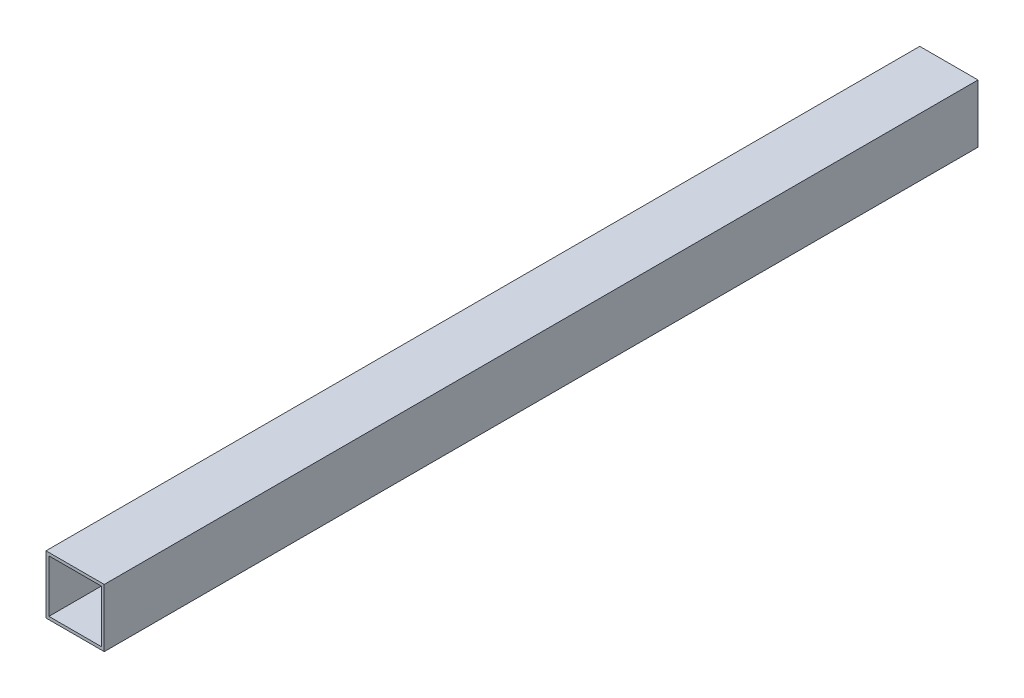
ISO-10303-21;
HEADER;
FILE_DESCRIPTION(('STEP AP214'),'2;1');
FILE_NAME('part.step','',(''),(''),'','','');
FILE_SCHEMA(('AUTOMOTIVE_DESIGN { 1 0 10303 214 1 1 1 1 }'));
ENDSEC;
DATA;
#1=APPLICATION_CONTEXT('core data for automotive mechanical design processes');
#2=APPLICATION_PROTOCOL_DEFINITION('international standard','automotive_design',2000,#1);
#3=PRODUCT_CONTEXT('',#1,'mechanical');
#4=PRODUCT('Part','Part','',(#3));
#5=PRODUCT_RELATED_PRODUCT_CATEGORY('part','',(#4));
#6=PRODUCT_DEFINITION_FORMATION('','',#4);
#7=PRODUCT_DEFINITION_CONTEXT('part definition',#1,'design');
#8=PRODUCT_DEFINITION('design','',#6,#7);
#9=PRODUCT_DEFINITION_SHAPE('','',#8);
#10=(LENGTH_UNIT() NAMED_UNIT(*) SI_UNIT(.MILLI.,.METRE.));
#11=(NAMED_UNIT(*) PLANE_ANGLE_UNIT() SI_UNIT($,.RADIAN.));
#12=(NAMED_UNIT(*) SI_UNIT($,.STERADIAN.) SOLID_ANGLE_UNIT());
#13=UNCERTAINTY_MEASURE_WITH_UNIT(LENGTH_MEASURE(1.E-05),#10,'distance_accuracy_value','');
#14=(GEOMETRIC_REPRESENTATION_CONTEXT(3) GLOBAL_UNCERTAINTY_ASSIGNED_CONTEXT((#13)) GLOBAL_UNIT_ASSIGNED_CONTEXT((#10,
#11,#12)) REPRESENTATION_CONTEXT('',''));
#15=CARTESIAN_POINT('',(0.,0.,0.));
#16=DIRECTION('',(0.,0.,1.));
#17=DIRECTION('',(1.,0.,0.));
#18=AXIS2_PLACEMENT_3D('',#15,#16,#17);
#19=CARTESIAN_POINT('',(-20.,-20.,600.));
#20=DIRECTION('',(0.,0.,1.));
#21=DIRECTION('',(1.,0.,0.));
#22=AXIS2_PLACEMENT_3D('',#19,#20,#21);
#23=PLANE('',#22);
#24=DIRECTION('',(0.,-1.,0.));
#25=VECTOR('',#24,1.);
#26=CARTESIAN_POINT('',(-20.,-20.,600.));
#27=LINE('',#26,#25);
#28=CARTESIAN_POINT('',(-20.,20.,600.));
#29=VERTEX_POINT('',#28);
#30=CARTESIAN_POINT('',(-20.,-20.,600.));
#31=VERTEX_POINT('',#30);
#32=EDGE_CURVE('E156',#29,#31,#27,.T.);
#33=ORIENTED_EDGE('',*,*,#32,.T.);
#34=DIRECTION('',(1.,0.,0.));
#35=VECTOR('',#34,1.);
#36=CARTESIAN_POINT('',(20.,-20.,600.));
#37=LINE('',#36,#35);
#38=CARTESIAN_POINT('',(20.,-20.,600.));
#39=VERTEX_POINT('',#38);
#40=EDGE_CURVE('E159',#31,#39,#37,.T.);
#41=ORIENTED_EDGE('',*,*,#40,.T.);
#42=DIRECTION('',(0.,1.,0.));
#43=VECTOR('',#42,1.);
#44=CARTESIAN_POINT('',(20.,-20.,600.));
#45=LINE('',#44,#43);
#46=CARTESIAN_POINT('',(20.,20.,600.));
#47=VERTEX_POINT('',#46);
#48=EDGE_CURVE('E162',#39,#47,#45,.T.);
#49=ORIENTED_EDGE('',*,*,#48,.T.);
#50=DIRECTION('',(-1.,0.,0.));
#51=VECTOR('',#50,1.);
#52=CARTESIAN_POINT('',(20.,20.,600.));
#53=LINE('',#52,#51);
#54=EDGE_CURVE('E164',#47,#29,#53,.T.);
#55=ORIENTED_EDGE('',*,*,#54,.T.);
#56=EDGE_LOOP('',(#33,#41,#49,#55));
#57=FACE_BOUND('',#56,.T.);
#58=DIRECTION('',(1.,0.,0.));
#59=VECTOR('',#58,1.);
#60=CARTESIAN_POINT('',(20.,-18.,600.));
#61=LINE('',#60,#59);
#62=CARTESIAN_POINT('',(-18.,-18.,600.));
#63=VERTEX_POINT('',#62);
#64=CARTESIAN_POINT('',(18.,-18.,600.));
#65=VERTEX_POINT('',#64);
#66=EDGE_CURVE('E128',#63,#65,#61,.T.);
#67=ORIENTED_EDGE('',*,*,#66,.F.);
#68=DIRECTION('',(0.,-1.,0.));
#69=VECTOR('',#68,1.);
#70=CARTESIAN_POINT('',(-18.,-20.,600.));
#71=LINE('',#70,#69);
#72=CARTESIAN_POINT('',(-18.,18.,600.));
#73=VERTEX_POINT('',#72);
#74=EDGE_CURVE('E120',#73,#63,#71,.T.);
#75=ORIENTED_EDGE('',*,*,#74,.F.);
#76=DIRECTION('',(-1.,0.,0.));
#77=VECTOR('',#76,1.);
#78=CARTESIAN_POINT('',(20.,18.,600.));
#79=LINE('',#78,#77);
#80=CARTESIAN_POINT('',(18.,18.,600.));
#81=VERTEX_POINT('',#80);
#82=EDGE_CURVE('E142',#81,#73,#79,.T.);
#83=ORIENTED_EDGE('',*,*,#82,.F.);
#84=DIRECTION('',(0.,1.,0.));
#85=VECTOR('',#84,1.);
#86=CARTESIAN_POINT('',(18.,-20.,600.));
#87=LINE('',#86,#85);
#88=EDGE_CURVE('E140',#65,#81,#87,.T.);
#89=ORIENTED_EDGE('',*,*,#88,.F.);
#90=EDGE_LOOP('',(#67,#75,#83,#89));
#91=FACE_BOUND('',#90,.T.);
#92=ADVANCED_FACE('F55',(#57,#91),#23,.T.);
#93=CARTESIAN_POINT('',(-20.,-20.,0.));
#94=DIRECTION('',(0.,0.,1.));
#95=DIRECTION('',(1.,0.,0.));
#96=AXIS2_PLACEMENT_3D('',#93,#94,#95);
#97=PLANE('',#96);
#98=DIRECTION('',(0.,-1.,0.));
#99=VECTOR('',#98,1.);
#100=CARTESIAN_POINT('',(-20.,-20.,0.));
#101=LINE('',#100,#99);
#102=CARTESIAN_POINT('',(-20.,20.,0.));
#103=VERTEX_POINT('',#102);
#104=CARTESIAN_POINT('',(-20.,-20.,0.));
#105=VERTEX_POINT('',#104);
#106=EDGE_CURVE('E136',#103,#105,#101,.T.);
#107=ORIENTED_EDGE('',*,*,#106,.F.);
#108=DIRECTION('',(-1.,0.,0.));
#109=VECTOR('',#108,1.);
#110=CARTESIAN_POINT('',(20.,20.,0.));
#111=LINE('',#110,#109);
#112=CARTESIAN_POINT('',(20.,20.,0.));
#113=VERTEX_POINT('',#112);
#114=EDGE_CURVE('E160',#113,#103,#111,.T.);
#115=ORIENTED_EDGE('',*,*,#114,.F.);
#116=DIRECTION('',(0.,1.,0.));
#117=VECTOR('',#116,1.);
#118=CARTESIAN_POINT('',(20.,-20.,0.));
#119=LINE('',#118,#117);
#120=CARTESIAN_POINT('',(20.,-20.,0.));
#121=VERTEX_POINT('',#120);
#122=EDGE_CURVE('E171',#121,#113,#119,.T.);
#123=ORIENTED_EDGE('',*,*,#122,.F.);
#124=DIRECTION('',(1.,0.,0.));
#125=VECTOR('',#124,1.);
#126=CARTESIAN_POINT('',(20.,-20.,0.));
#127=LINE('',#126,#125);
#128=EDGE_CURVE('E169',#105,#121,#127,.T.);
#129=ORIENTED_EDGE('',*,*,#128,.F.);
#130=EDGE_LOOP('',(#107,#115,#123,#129));
#131=FACE_BOUND('',#130,.T.);
#132=DIRECTION('',(0.,-1.,0.));
#133=VECTOR('',#132,1.);
#134=CARTESIAN_POINT('',(-18.,-20.,0.));
#135=LINE('',#134,#133);
#136=CARTESIAN_POINT('',(-18.,18.,0.));
#137=VERTEX_POINT('',#136);
#138=CARTESIAN_POINT('',(-18.,-18.,0.));
#139=VERTEX_POINT('',#138);
#140=EDGE_CURVE('E78',#137,#139,#135,.T.);
#141=ORIENTED_EDGE('',*,*,#140,.T.);
#142=DIRECTION('',(1.,0.,0.));
#143=VECTOR('',#142,1.);
#144=CARTESIAN_POINT('',(20.,-18.,0.));
#145=LINE('',#144,#143);
#146=CARTESIAN_POINT('',(18.,-18.,0.));
#147=VERTEX_POINT('',#146);
#148=EDGE_CURVE('E135',#139,#147,#145,.T.);
#149=ORIENTED_EDGE('',*,*,#148,.T.);
#150=DIRECTION('',(0.,1.,0.));
#151=VECTOR('',#150,1.);
#152=CARTESIAN_POINT('',(18.,-20.,0.));
#153=LINE('',#152,#151);
#154=CARTESIAN_POINT('',(18.,18.,0.));
#155=VERTEX_POINT('',#154);
#156=EDGE_CURVE('E148',#147,#155,#153,.T.);
#157=ORIENTED_EDGE('',*,*,#156,.T.);
#158=DIRECTION('',(-1.,0.,0.));
#159=VECTOR('',#158,1.);
#160=CARTESIAN_POINT('',(20.,18.,0.));
#161=LINE('',#160,#159);
#162=EDGE_CURVE('E129',#155,#137,#161,.T.);
#163=ORIENTED_EDGE('',*,*,#162,.T.);
#164=EDGE_LOOP('',(#141,#149,#157,#163));
#165=FACE_BOUND('',#164,.T.);
#166=ADVANCED_FACE('F189',(#131,#165),#97,.F.);
#167=CARTESIAN_POINT('',(-20.,-20.,600.));
#168=DIRECTION('',(1.,0.,0.));
#169=DIRECTION('',(0.,0.,-1.));
#170=AXIS2_PLACEMENT_3D('',#167,#168,#169);
#171=PLANE('',#170);
#172=ORIENTED_EDGE('',*,*,#106,.T.);
#173=DIRECTION('',(0.,0.,-1.));
#174=VECTOR('',#173,1.);
#175=CARTESIAN_POINT('',(-20.,-20.,600.));
#176=LINE('',#175,#174);
#177=EDGE_CURVE('E12',#31,#105,#176,.T.);
#178=ORIENTED_EDGE('',*,*,#177,.F.);
#179=ORIENTED_EDGE('',*,*,#32,.F.);
#180=DIRECTION('',(0.,0.,-1.));
#181=VECTOR('',#180,1.);
#182=CARTESIAN_POINT('',(-20.,20.,600.));
#183=LINE('',#182,#181);
#184=EDGE_CURVE('E166',#29,#103,#183,.T.);
#185=ORIENTED_EDGE('',*,*,#184,.T.);
#186=EDGE_LOOP('',(#172,#178,#179,#185));
#187=FACE_BOUND('',#186,.T.);
#188=ADVANCED_FACE('F57',(#187),#171,.F.);
#189=CARTESIAN_POINT('',(20.,-20.,600.));
#190=DIRECTION('',(0.,1.,0.));
#191=DIRECTION('',(-1.,0.,0.));
#192=AXIS2_PLACEMENT_3D('',#189,#190,#191);
#193=PLANE('',#192);
#194=ORIENTED_EDGE('',*,*,#128,.T.);
#195=DIRECTION('',(0.,0.,-1.));
#196=VECTOR('',#195,1.);
#197=CARTESIAN_POINT('',(20.,-20.,600.));
#198=LINE('',#197,#196);
#199=EDGE_CURVE('E63',#39,#121,#198,.T.);
#200=ORIENTED_EDGE('',*,*,#199,.F.);
#201=ORIENTED_EDGE('',*,*,#40,.F.);
#202=ORIENTED_EDGE('',*,*,#177,.T.);
#203=EDGE_LOOP('',(#194,#200,#201,#202));
#204=FACE_BOUND('',#203,.T.);
#205=ADVANCED_FACE('F199',(#204),#193,.F.);
#206=CARTESIAN_POINT('',(20.,-20.,600.));
#207=DIRECTION('',(-1.,0.,0.));
#208=DIRECTION('',(0.,0.,1.));
#209=AXIS2_PLACEMENT_3D('',#206,#207,#208);
#210=PLANE('',#209);
#211=ORIENTED_EDGE('',*,*,#122,.T.);
#212=DIRECTION('',(0.,0.,-1.));
#213=VECTOR('',#212,1.);
#214=CARTESIAN_POINT('',(20.,20.,600.));
#215=LINE('',#214,#213);
#216=EDGE_CURVE('E176',#47,#113,#215,.T.);
#217=ORIENTED_EDGE('',*,*,#216,.F.);
#218=ORIENTED_EDGE('',*,*,#48,.F.);
#219=ORIENTED_EDGE('',*,*,#199,.T.);
#220=EDGE_LOOP('',(#211,#217,#218,#219));
#221=FACE_BOUND('',#220,.T.);
#222=ADVANCED_FACE('F183',(#221),#210,.F.);
#223=CARTESIAN_POINT('',(20.,20.,600.));
#224=DIRECTION('',(0.,-1.,0.));
#225=DIRECTION('',(1.,0.,0.));
#226=AXIS2_PLACEMENT_3D('',#223,#224,#225);
#227=PLANE('',#226);
#228=ORIENTED_EDGE('',*,*,#114,.T.);
#229=ORIENTED_EDGE('',*,*,#184,.F.);
#230=ORIENTED_EDGE('',*,*,#54,.F.);
#231=ORIENTED_EDGE('',*,*,#216,.T.);
#232=EDGE_LOOP('',(#228,#229,#230,#231));
#233=FACE_BOUND('',#232,.T.);
#234=ADVANCED_FACE('F193',(#233),#227,.F.);
#235=CARTESIAN_POINT('',(-18.,-20.,600.));
#236=DIRECTION('',(1.,0.,0.));
#237=DIRECTION('',(0.,0.,-1.));
#238=AXIS2_PLACEMENT_3D('',#235,#236,#237);
#239=PLANE('',#238);
#240=ORIENTED_EDGE('',*,*,#140,.F.);
#241=DIRECTION('',(0.,0.,-1.));
#242=VECTOR('',#241,1.);
#243=CARTESIAN_POINT('',(-18.,18.,600.));
#244=LINE('',#243,#242);
#245=EDGE_CURVE('E124',#73,#137,#244,.T.);
#246=ORIENTED_EDGE('',*,*,#245,.F.);
#247=ORIENTED_EDGE('',*,*,#74,.T.);
#248=DIRECTION('',(0.,0.,-1.));
#249=VECTOR('',#248,1.);
#250=CARTESIAN_POINT('',(-18.,-18.,600.));
#251=LINE('',#250,#249);
#252=EDGE_CURVE('E123',#63,#139,#251,.T.);
#253=ORIENTED_EDGE('',*,*,#252,.T.);
#254=EDGE_LOOP('',(#240,#246,#247,#253));
#255=FACE_BOUND('',#254,.T.);
#256=ADVANCED_FACE('F122',(#255),#239,.T.);
#257=CARTESIAN_POINT('',(20.,-18.,600.));
#258=DIRECTION('',(0.,1.,0.));
#259=DIRECTION('',(-1.,0.,0.));
#260=AXIS2_PLACEMENT_3D('',#257,#258,#259);
#261=PLANE('',#260);
#262=ORIENTED_EDGE('',*,*,#148,.F.);
#263=ORIENTED_EDGE('',*,*,#252,.F.);
#264=ORIENTED_EDGE('',*,*,#66,.T.);
#265=DIRECTION('',(0.,0.,-1.));
#266=VECTOR('',#265,1.);
#267=CARTESIAN_POINT('',(18.,-18.,600.));
#268=LINE('',#267,#266);
#269=EDGE_CURVE('E137',#65,#147,#268,.T.);
#270=ORIENTED_EDGE('',*,*,#269,.T.);
#271=EDGE_LOOP('',(#262,#263,#264,#270));
#272=FACE_BOUND('',#271,.T.);
#273=ADVANCED_FACE('F132',(#272),#261,.T.);
#274=CARTESIAN_POINT('',(18.,-20.,600.));
#275=DIRECTION('',(-1.,0.,0.));
#276=DIRECTION('',(0.,0.,1.));
#277=AXIS2_PLACEMENT_3D('',#274,#275,#276);
#278=PLANE('',#277);
#279=ORIENTED_EDGE('',*,*,#156,.F.);
#280=ORIENTED_EDGE('',*,*,#269,.F.);
#281=ORIENTED_EDGE('',*,*,#88,.T.);
#282=DIRECTION('',(0.,0.,-1.));
#283=VECTOR('',#282,1.);
#284=CARTESIAN_POINT('',(18.,18.,600.));
#285=LINE('',#284,#283);
#286=EDGE_CURVE('E70',#81,#155,#285,.T.);
#287=ORIENTED_EDGE('',*,*,#286,.T.);
#288=EDGE_LOOP('',(#279,#280,#281,#287));
#289=FACE_BOUND('',#288,.T.);
#290=ADVANCED_FACE('F222',(#289),#278,.T.);
#291=CARTESIAN_POINT('',(20.,18.,600.));
#292=DIRECTION('',(0.,-1.,0.));
#293=DIRECTION('',(1.,0.,0.));
#294=AXIS2_PLACEMENT_3D('',#291,#292,#293);
#295=PLANE('',#294);
#296=ORIENTED_EDGE('',*,*,#162,.F.);
#297=ORIENTED_EDGE('',*,*,#286,.F.);
#298=ORIENTED_EDGE('',*,*,#82,.T.);
#299=ORIENTED_EDGE('',*,*,#245,.T.);
#300=EDGE_LOOP('',(#296,#297,#298,#299));
#301=FACE_BOUND('',#300,.T.);
#302=ADVANCED_FACE('F226',(#301),#295,.T.);
#303=CLOSED_SHELL('',(#92,#166,#188,#205,#222,#234,#256,#273,#290,#302));
#304=MANIFOLD_SOLID_BREP('B2',#303);
#305=ADVANCED_BREP_SHAPE_REPRESENTATION('',(#18,#304),#14);
#306=SHAPE_DEFINITION_REPRESENTATION(#9,#305);
ENDSEC;
END-ISO-10303-21;
